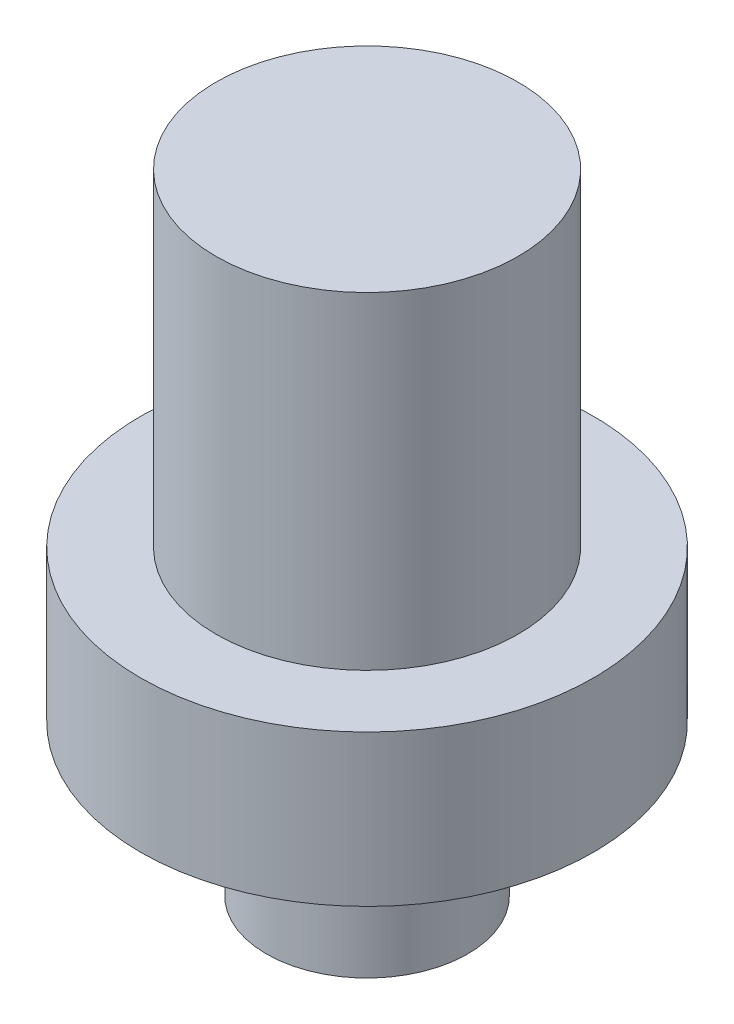
ISO-10303-21;
HEADER;
FILE_DESCRIPTION(('STEP AP214'),'2;1');
FILE_NAME('part.step','',(''),(''),'','','');
FILE_SCHEMA(('AUTOMOTIVE_DESIGN { 1 0 10303 214 1 1 1 1 }'));
ENDSEC;
DATA;
#1=APPLICATION_CONTEXT('core data for automotive mechanical design processes');
#2=APPLICATION_PROTOCOL_DEFINITION('international standard','automotive_design',2000,#1);
#3=PRODUCT_CONTEXT('',#1,'mechanical');
#4=PRODUCT('Part','Part','',(#3));
#5=PRODUCT_RELATED_PRODUCT_CATEGORY('part','',(#4));
#6=PRODUCT_DEFINITION_FORMATION('','',#4);
#7=PRODUCT_DEFINITION_CONTEXT('part definition',#1,'design');
#8=PRODUCT_DEFINITION('design','',#6,#7);
#9=PRODUCT_DEFINITION_SHAPE('','',#8);
#10=(LENGTH_UNIT() NAMED_UNIT(*) SI_UNIT(.MILLI.,.METRE.));
#11=(NAMED_UNIT(*) PLANE_ANGLE_UNIT() SI_UNIT($,.RADIAN.));
#12=(NAMED_UNIT(*) SI_UNIT($,.STERADIAN.) SOLID_ANGLE_UNIT());
#13=UNCERTAINTY_MEASURE_WITH_UNIT(LENGTH_MEASURE(1.E-05),#10,'distance_accuracy_value','');
#14=(GEOMETRIC_REPRESENTATION_CONTEXT(3) GLOBAL_UNCERTAINTY_ASSIGNED_CONTEXT((#13)) GLOBAL_UNIT_ASSIGNED_CONTEXT((#10,
#11,#12)) REPRESENTATION_CONTEXT('',''));
#15=CARTESIAN_POINT('',(0.,0.,0.));
#16=DIRECTION('',(0.,0.,1.));
#17=DIRECTION('',(1.,0.,0.));
#18=AXIS2_PLACEMENT_3D('',#15,#16,#17);
#19=CARTESIAN_POINT('',(0.,4.57148632976178,0.));
#20=DIRECTION('',(0.,1.,0.));
#21=DIRECTION('',(0.,0.,1.));
#22=AXIS2_PLACEMENT_3D('',#19,#20,#21);
#23=CYLINDRICAL_SURFACE('',#22,2.);
#24=CARTESIAN_POINT('',(0.,0.,0.));
#25=DIRECTION('',(0.,1.,0.));
#26=DIRECTION('',(0.,0.,1.));
#27=AXIS2_PLACEMENT_3D('',#24,#25,#26);
#28=CIRCLE('',#27,2.);
#29=CARTESIAN_POINT('',(0.,0.,2.));
#30=VERTEX_POINT('',#29);
#31=EDGE_CURVE('E55',#30,#30,#28,.T.);
#32=ORIENTED_EDGE('',*,*,#31,.F.);
#33=EDGE_LOOP('',(#32));
#34=FACE_BOUND('',#33,.T.);
#35=CARTESIAN_POINT('',(0.,-3.,0.));
#36=DIRECTION('',(0.,1.,0.));
#37=DIRECTION('',(0.,0.,1.));
#38=AXIS2_PLACEMENT_3D('',#35,#36,#37);
#39=CIRCLE('',#38,2.);
#40=CARTESIAN_POINT('',(0.,-3.,2.));
#41=VERTEX_POINT('',#40);
#42=EDGE_CURVE('E10',#41,#41,#39,.T.);
#43=ORIENTED_EDGE('',*,*,#42,.T.);
#44=EDGE_LOOP('',(#43));
#45=FACE_BOUND('',#44,.T.);
#46=ADVANCED_FACE('F33',(#34,#45),#23,.T.);
#47=CARTESIAN_POINT('',(0.,-3.,0.));
#48=DIRECTION('',(0.,1.,0.));
#49=DIRECTION('',(0.,0.,1.));
#50=AXIS2_PLACEMENT_3D('',#47,#48,#49);
#51=PLANE('',#50);
#52=ORIENTED_EDGE('',*,*,#42,.F.);
#53=EDGE_LOOP('',(#52));
#54=FACE_BOUND('',#53,.T.);
#55=ADVANCED_FACE('F62',(#54),#51,.F.);
#56=CARTESIAN_POINT('',(3.,9.5,0.));
#57=DIRECTION('',(0.,-1.,0.));
#58=DIRECTION('',(0.,0.,-1.));
#59=AXIS2_PLACEMENT_3D('',#56,#57,#58);
#60=PLANE('',#59);
#61=CARTESIAN_POINT('',(0.,9.5,0.));
#62=DIRECTION('',(0.,1.,0.));
#63=DIRECTION('',(0.,0.,1.));
#64=AXIS2_PLACEMENT_3D('',#61,#62,#63);
#65=CIRCLE('',#64,3.);
#66=CARTESIAN_POINT('',(0.,9.5,3.));
#67=VERTEX_POINT('',#66);
#68=EDGE_CURVE('E39',#67,#67,#65,.T.);
#69=ORIENTED_EDGE('',*,*,#68,.T.);
#70=EDGE_LOOP('',(#69));
#71=FACE_BOUND('',#70,.T.);
#72=ADVANCED_FACE('F66',(#71),#60,.F.);
#73=CARTESIAN_POINT('',(0.,4.57148632976178,0.));
#74=DIRECTION('',(0.,1.,0.));
#75=DIRECTION('',(0.,0.,1.));
#76=AXIS2_PLACEMENT_3D('',#73,#74,#75);
#77=CYLINDRICAL_SURFACE('',#76,3.);
#78=ORIENTED_EDGE('',*,*,#68,.F.);
#79=EDGE_LOOP('',(#78));
#80=FACE_BOUND('',#79,.T.);
#81=CARTESIAN_POINT('',(0.,3.,0.));
#82=DIRECTION('',(0.,1.,0.));
#83=DIRECTION('',(0.,0.,1.));
#84=AXIS2_PLACEMENT_3D('',#81,#82,#83);
#85=CIRCLE('',#84,3.);
#86=CARTESIAN_POINT('',(0.,3.,3.));
#87=VERTEX_POINT('',#86);
#88=EDGE_CURVE('E43',#87,#87,#85,.T.);
#89=ORIENTED_EDGE('',*,*,#88,.T.);
#90=EDGE_LOOP('',(#89));
#91=FACE_BOUND('',#90,.T.);
#92=ADVANCED_FACE('F71',(#80,#91),#77,.T.);
#93=CARTESIAN_POINT('',(4.5,3.,0.));
#94=DIRECTION('',(0.,-1.,0.));
#95=DIRECTION('',(0.,0.,-1.));
#96=AXIS2_PLACEMENT_3D('',#93,#94,#95);
#97=PLANE('',#96);
#98=ORIENTED_EDGE('',*,*,#88,.F.);
#99=EDGE_LOOP('',(#98));
#100=FACE_BOUND('',#99,.T.);
#101=CARTESIAN_POINT('',(0.,3.,0.));
#102=DIRECTION('',(0.,1.,0.));
#103=DIRECTION('',(0.,0.,1.));
#104=AXIS2_PLACEMENT_3D('',#101,#102,#103);
#105=CIRCLE('',#104,4.5);
#106=CARTESIAN_POINT('',(0.,3.,4.5));
#107=VERTEX_POINT('',#106);
#108=EDGE_CURVE('E47',#107,#107,#105,.T.);
#109=ORIENTED_EDGE('',*,*,#108,.T.);
#110=EDGE_LOOP('',(#109));
#111=FACE_BOUND('',#110,.T.);
#112=ADVANCED_FACE('F76',(#100,#111),#97,.F.);
#113=CARTESIAN_POINT('',(0.,4.57148632976178,0.));
#114=DIRECTION('',(0.,1.,0.));
#115=DIRECTION('',(0.,0.,1.));
#116=AXIS2_PLACEMENT_3D('',#113,#114,#115);
#117=CYLINDRICAL_SURFACE('',#116,4.5);
#118=ORIENTED_EDGE('',*,*,#108,.F.);
#119=EDGE_LOOP('',(#118));
#120=FACE_BOUND('',#119,.T.);
#121=CARTESIAN_POINT('',(0.,0.,0.));
#122=DIRECTION('',(0.,1.,0.));
#123=DIRECTION('',(0.,0.,1.));
#124=AXIS2_PLACEMENT_3D('',#121,#122,#123);
#125=CIRCLE('',#124,4.5);
#126=CARTESIAN_POINT('',(0.,0.,4.5));
#127=VERTEX_POINT('',#126);
#128=EDGE_CURVE('E52',#127,#127,#125,.T.);
#129=ORIENTED_EDGE('',*,*,#128,.T.);
#130=EDGE_LOOP('',(#129));
#131=FACE_BOUND('',#130,.T.);
#132=ADVANCED_FACE('F80',(#120,#131),#117,.T.);
#133=CARTESIAN_POINT('',(2.,0.,0.));
#134=DIRECTION('',(0.,1.,0.));
#135=DIRECTION('',(0.,0.,1.));
#136=AXIS2_PLACEMENT_3D('',#133,#134,#135);
#137=PLANE('',#136);
#138=ORIENTED_EDGE('',*,*,#128,.F.);
#139=EDGE_LOOP('',(#138));
#140=FACE_BOUND('',#139,.T.);
#141=ORIENTED_EDGE('',*,*,#31,.T.);
#142=EDGE_LOOP('',(#141));
#143=FACE_BOUND('',#142,.T.);
#144=ADVANCED_FACE('F59',(#140,#143),#137,.F.);
#145=CLOSED_SHELL('',(#46,#55,#72,#92,#112,#132,#144));
#146=MANIFOLD_SOLID_BREP('B2',#145);
#147=ADVANCED_BREP_SHAPE_REPRESENTATION('',(#18,#146),#14);
#148=SHAPE_DEFINITION_REPRESENTATION(#9,#147);
ENDSEC;
END-ISO-10303-21;
